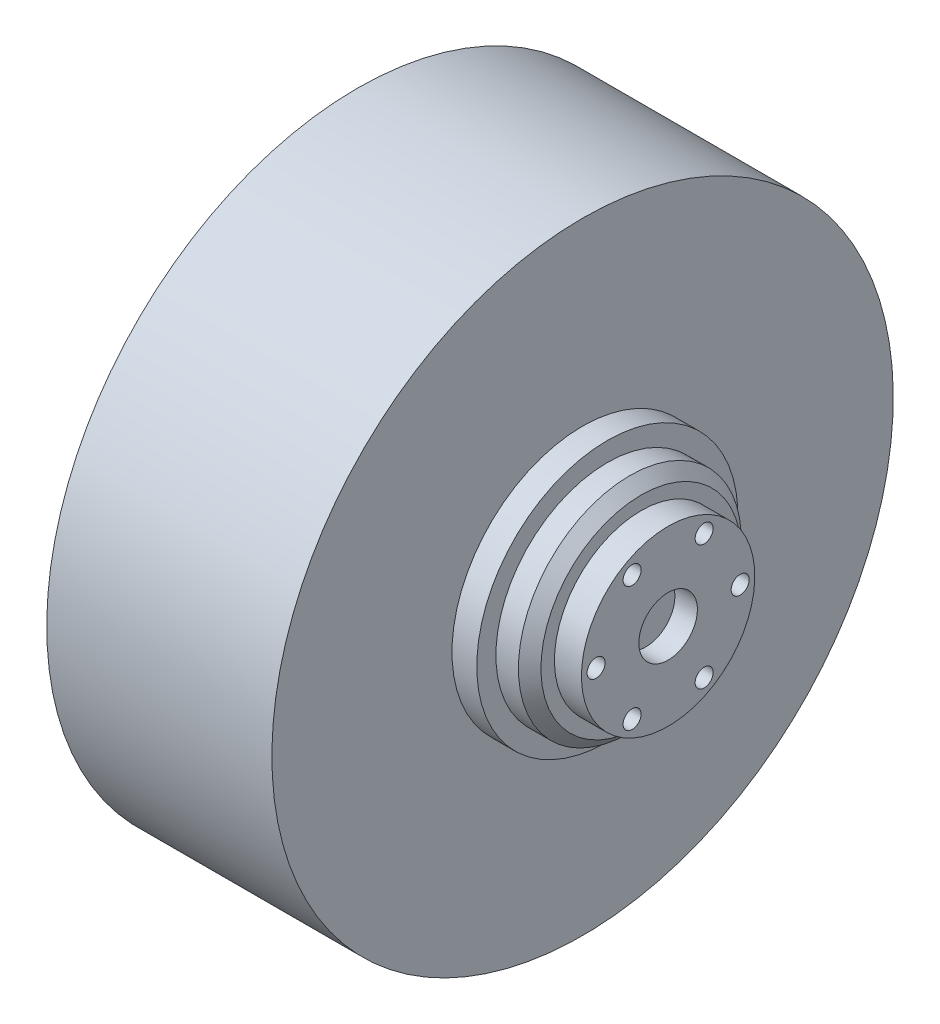
ISO-10303-21;
HEADER;
FILE_DESCRIPTION(('STEP AP214'),'2;1');
FILE_NAME('part.step','',(''),(''),'','','');
FILE_SCHEMA(('AUTOMOTIVE_DESIGN { 1 0 10303 214 1 1 1 1 }'));
ENDSEC;
DATA;
#1=APPLICATION_CONTEXT('core data for automotive mechanical design processes');
#2=APPLICATION_PROTOCOL_DEFINITION('international standard','automotive_design',2000,#1);
#3=PRODUCT_CONTEXT('',#1,'mechanical');
#4=PRODUCT('Part','Part','',(#3));
#5=PRODUCT_RELATED_PRODUCT_CATEGORY('part','',(#4));
#6=PRODUCT_DEFINITION_FORMATION('','',#4);
#7=PRODUCT_DEFINITION_CONTEXT('part definition',#1,'design');
#8=PRODUCT_DEFINITION('design','',#6,#7);
#9=PRODUCT_DEFINITION_SHAPE('','',#8);
#10=(LENGTH_UNIT() NAMED_UNIT(*) SI_UNIT(.MILLI.,.METRE.));
#11=(NAMED_UNIT(*) PLANE_ANGLE_UNIT() SI_UNIT($,.RADIAN.));
#12=(NAMED_UNIT(*) SI_UNIT($,.STERADIAN.) SOLID_ANGLE_UNIT());
#13=UNCERTAINTY_MEASURE_WITH_UNIT(LENGTH_MEASURE(1.E-05),#10,'distance_accuracy_value','');
#14=(GEOMETRIC_REPRESENTATION_CONTEXT(3) GLOBAL_UNCERTAINTY_ASSIGNED_CONTEXT((#13)) GLOBAL_UNIT_ASSIGNED_CONTEXT((#10,
#11,#12)) REPRESENTATION_CONTEXT('',''));
#15=CARTESIAN_POINT('',(0.,0.,0.));
#16=DIRECTION('',(0.,0.,1.));
#17=DIRECTION('',(1.,0.,0.));
#18=AXIS2_PLACEMENT_3D('',#15,#16,#17);
#19=CARTESIAN_POINT('',(-90.,0.,0.));
#20=DIRECTION('',(1.,0.,0.));
#21=DIRECTION('',(0.,1.,0.));
#22=AXIS2_PLACEMENT_3D('',#19,#20,#21);
#23=PLANE('',#22);
#24=CARTESIAN_POINT('',(-90.,0.,0.));
#25=DIRECTION('',(1.,0.,0.));
#26=DIRECTION('',(0.,1.,0.));
#27=AXIS2_PLACEMENT_3D('',#24,#25,#26);
#28=CIRCLE('',#27,36.5);
#29=CARTESIAN_POINT('',(-90.,36.5,0.));
#30=VERTEX_POINT('',#29);
#31=EDGE_CURVE('E10',#30,#30,#28,.T.);
#32=ORIENTED_EDGE('',*,*,#31,.F.);
#33=EDGE_LOOP('',(#32));
#34=FACE_BOUND('',#33,.T.);
#35=ADVANCED_FACE('F34',(#34),#23,.F.);
#36=CARTESIAN_POINT('',(90.,0.,0.));
#37=DIRECTION('',(1.,0.,0.));
#38=DIRECTION('',(0.,1.,0.));
#39=AXIS2_PLACEMENT_3D('',#36,#37,#38);
#40=CYLINDRICAL_SURFACE('',#39,36.5);
#41=CARTESIAN_POINT('',(-70.,0.,0.));
#42=DIRECTION('',(1.,0.,0.));
#43=DIRECTION('',(0.,1.,0.));
#44=AXIS2_PLACEMENT_3D('',#41,#42,#43);
#45=CIRCLE('',#44,36.5);
#46=CARTESIAN_POINT('',(-70.,36.5,0.));
#47=VERTEX_POINT('',#46);
#48=EDGE_CURVE('E40',#47,#47,#45,.T.);
#49=ORIENTED_EDGE('',*,*,#48,.F.);
#50=EDGE_LOOP('',(#49));
#51=FACE_BOUND('',#50,.T.);
#52=ORIENTED_EDGE('',*,*,#31,.T.);
#53=EDGE_LOOP('',(#52));
#54=FACE_BOUND('',#53,.T.);
#55=ADVANCED_FACE('F213',(#51,#54),#40,.T.);
#56=CARTESIAN_POINT('',(-70.,-36.5,0.));
#57=DIRECTION('',(1.,0.,0.));
#58=DIRECTION('',(0.,1.,0.));
#59=AXIS2_PLACEMENT_3D('',#56,#57,#58);
#60=PLANE('',#59);
#61=CARTESIAN_POINT('',(-70.,0.,0.));
#62=DIRECTION('',(1.,0.,0.));
#63=DIRECTION('',(0.,1.,0.));
#64=AXIS2_PLACEMENT_3D('',#61,#62,#63);
#65=CIRCLE('',#64,47.);
#66=CARTESIAN_POINT('',(-70.,47.,0.));
#67=VERTEX_POINT('',#66);
#68=EDGE_CURVE('E44',#67,#67,#65,.T.);
#69=ORIENTED_EDGE('',*,*,#68,.F.);
#70=EDGE_LOOP('',(#69));
#71=FACE_BOUND('',#70,.T.);
#72=ORIENTED_EDGE('',*,*,#48,.T.);
#73=EDGE_LOOP('',(#72));
#74=FACE_BOUND('',#73,.T.);
#75=ADVANCED_FACE('F208',(#71,#74),#60,.F.);
#76=CARTESIAN_POINT('',(90.,0.,0.));
#77=DIRECTION('',(1.,0.,0.));
#78=DIRECTION('',(0.,1.,0.));
#79=AXIS2_PLACEMENT_3D('',#76,#77,#78);
#80=CYLINDRICAL_SURFACE('',#79,47.);
#81=CARTESIAN_POINT('',(-48.,0.,0.));
#82=DIRECTION('',(1.,0.,0.));
#83=DIRECTION('',(0.,1.,0.));
#84=AXIS2_PLACEMENT_3D('',#81,#82,#83);
#85=CIRCLE('',#84,47.);
#86=CARTESIAN_POINT('',(-48.,47.,0.));
#87=VERTEX_POINT('',#86);
#88=EDGE_CURVE('E48',#87,#87,#85,.T.);
#89=ORIENTED_EDGE('',*,*,#88,.F.);
#90=EDGE_LOOP('',(#89));
#91=FACE_BOUND('',#90,.T.);
#92=ORIENTED_EDGE('',*,*,#68,.T.);
#93=EDGE_LOOP('',(#92));
#94=FACE_BOUND('',#93,.T.);
#95=ADVANCED_FACE('F202',(#91,#94),#80,.T.);
#96=CARTESIAN_POINT('',(-48.,-47.,0.));
#97=DIRECTION('',(1.,0.,0.));
#98=DIRECTION('',(0.,1.,0.));
#99=AXIS2_PLACEMENT_3D('',#96,#97,#98);
#100=PLANE('',#99);
#101=CARTESIAN_POINT('',(-48.,0.,0.));
#102=DIRECTION('',(1.,0.,0.));
#103=DIRECTION('',(0.,1.,0.));
#104=AXIS2_PLACEMENT_3D('',#101,#102,#103);
#105=CIRCLE('',#104,138.);
#106=CARTESIAN_POINT('',(-48.,138.,0.));
#107=VERTEX_POINT('',#106);
#108=EDGE_CURVE('E53',#107,#107,#105,.T.);
#109=ORIENTED_EDGE('',*,*,#108,.F.);
#110=EDGE_LOOP('',(#109));
#111=FACE_BOUND('',#110,.T.);
#112=ORIENTED_EDGE('',*,*,#88,.T.);
#113=EDGE_LOOP('',(#112));
#114=FACE_BOUND('',#113,.T.);
#115=ADVANCED_FACE('F196',(#111,#114),#100,.F.);
#116=CARTESIAN_POINT('',(90.,0.,0.));
#117=DIRECTION('',(1.,0.,0.));
#118=DIRECTION('',(0.,1.,0.));
#119=AXIS2_PLACEMENT_3D('',#116,#117,#118);
#120=CYLINDRICAL_SURFACE('',#119,138.);
#121=CARTESIAN_POINT('',(52.,0.,0.));
#122=DIRECTION('',(1.,0.,0.));
#123=DIRECTION('',(0.,1.,0.));
#124=AXIS2_PLACEMENT_3D('',#121,#122,#123);
#125=CIRCLE('',#124,138.);
#126=CARTESIAN_POINT('',(52.,138.,0.));
#127=VERTEX_POINT('',#126);
#128=EDGE_CURVE('E56',#127,#127,#125,.T.);
#129=ORIENTED_EDGE('',*,*,#128,.F.);
#130=EDGE_LOOP('',(#129));
#131=FACE_BOUND('',#130,.T.);
#132=ORIENTED_EDGE('',*,*,#108,.T.);
#133=EDGE_LOOP('',(#132));
#134=FACE_BOUND('',#133,.T.);
#135=ADVANCED_FACE('F190',(#131,#134),#120,.T.);
#136=CARTESIAN_POINT('',(52.,-138.,0.));
#137=DIRECTION('',(-1.,0.,0.));
#138=DIRECTION('',(0.,-1.,0.));
#139=AXIS2_PLACEMENT_3D('',#136,#137,#138);
#140=PLANE('',#139);
#141=CARTESIAN_POINT('',(52.,0.,0.));
#142=DIRECTION('',(1.,0.,0.));
#143=DIRECTION('',(0.,1.,0.));
#144=AXIS2_PLACEMENT_3D('',#141,#142,#143);
#145=CIRCLE('',#144,58.);
#146=CARTESIAN_POINT('',(52.,58.,0.));
#147=VERTEX_POINT('',#146);
#148=EDGE_CURVE('E59',#147,#147,#145,.T.);
#149=ORIENTED_EDGE('',*,*,#148,.F.);
#150=EDGE_LOOP('',(#149));
#151=FACE_BOUND('',#150,.T.);
#152=ORIENTED_EDGE('',*,*,#128,.T.);
#153=EDGE_LOOP('',(#152));
#154=FACE_BOUND('',#153,.T.);
#155=ADVANCED_FACE('F184',(#151,#154),#140,.F.);
#156=CARTESIAN_POINT('',(90.,0.,0.));
#157=DIRECTION('',(1.,0.,0.));
#158=DIRECTION('',(0.,1.,0.));
#159=AXIS2_PLACEMENT_3D('',#156,#157,#158);
#160=CYLINDRICAL_SURFACE('',#159,58.);
#161=CARTESIAN_POINT('',(63.,0.,0.));
#162=DIRECTION('',(1.,0.,0.));
#163=DIRECTION('',(0.,1.,0.));
#164=AXIS2_PLACEMENT_3D('',#161,#162,#163);
#165=CIRCLE('',#164,58.);
#166=CARTESIAN_POINT('',(63.,58.,0.));
#167=VERTEX_POINT('',#166);
#168=EDGE_CURVE('E62',#167,#167,#165,.T.);
#169=ORIENTED_EDGE('',*,*,#168,.F.);
#170=EDGE_LOOP('',(#169));
#171=FACE_BOUND('',#170,.T.);
#172=ORIENTED_EDGE('',*,*,#148,.T.);
#173=EDGE_LOOP('',(#172));
#174=FACE_BOUND('',#173,.T.);
#175=ADVANCED_FACE('F178',(#171,#174),#160,.T.);
#176=CARTESIAN_POINT('',(63.,-58.,0.));
#177=DIRECTION('',(-1.,0.,0.));
#178=DIRECTION('',(0.,-1.,0.));
#179=AXIS2_PLACEMENT_3D('',#176,#177,#178);
#180=PLANE('',#179);
#181=CARTESIAN_POINT('',(63.,0.,0.));
#182=DIRECTION('',(1.,0.,0.));
#183=DIRECTION('',(0.,1.,0.));
#184=AXIS2_PLACEMENT_3D('',#181,#182,#183);
#185=CIRCLE('',#184,49.5);
#186=CARTESIAN_POINT('',(63.,49.5,0.));
#187=VERTEX_POINT('',#186);
#188=EDGE_CURVE('E65',#187,#187,#185,.T.);
#189=ORIENTED_EDGE('',*,*,#188,.F.);
#190=EDGE_LOOP('',(#189));
#191=FACE_BOUND('',#190,.T.);
#192=ORIENTED_EDGE('',*,*,#168,.T.);
#193=EDGE_LOOP('',(#192));
#194=FACE_BOUND('',#193,.T.);
#195=ADVANCED_FACE('F172',(#191,#194),#180,.F.);
#196=CARTESIAN_POINT('',(90.,0.,0.));
#197=DIRECTION('',(1.,0.,0.));
#198=DIRECTION('',(0.,1.,0.));
#199=AXIS2_PLACEMENT_3D('',#196,#197,#198);
#200=CYLINDRICAL_SURFACE('',#199,49.5);
#201=CARTESIAN_POINT('',(73.,0.,0.));
#202=DIRECTION('',(1.,0.,0.));
#203=DIRECTION('',(0.,1.,0.));
#204=AXIS2_PLACEMENT_3D('',#201,#202,#203);
#205=CIRCLE('',#204,49.5);
#206=CARTESIAN_POINT('',(73.,49.5,0.));
#207=VERTEX_POINT('',#206);
#208=EDGE_CURVE('E68',#207,#207,#205,.T.);
#209=ORIENTED_EDGE('',*,*,#208,.F.);
#210=EDGE_LOOP('',(#209));
#211=FACE_BOUND('',#210,.T.);
#212=ORIENTED_EDGE('',*,*,#188,.T.);
#213=EDGE_LOOP('',(#212));
#214=FACE_BOUND('',#213,.T.);
#215=ADVANCED_FACE('F166',(#211,#214),#200,.T.);
#216=CARTESIAN_POINT('',(73.,0.,0.));
#217=DIRECTION('',(-1.,0.,0.));
#218=DIRECTION('',(0.,-1.,0.));
#219=AXIS2_PLACEMENT_3D('',#216,#217,#218);
#220=CONICAL_SURFACE('',#219,49.5,0.785398163397448);
#221=CARTESIAN_POINT('',(78.,0.,0.));
#222=DIRECTION('',(1.,0.,0.));
#223=DIRECTION('',(0.,1.,0.));
#224=AXIS2_PLACEMENT_3D('',#221,#222,#223);
#225=CIRCLE('',#224,44.5);
#226=CARTESIAN_POINT('',(78.,44.5,0.));
#227=VERTEX_POINT('',#226);
#228=EDGE_CURVE('E71',#227,#227,#225,.T.);
#229=ORIENTED_EDGE('',*,*,#228,.F.);
#230=EDGE_LOOP('',(#229));
#231=FACE_BOUND('',#230,.T.);
#232=ORIENTED_EDGE('',*,*,#208,.T.);
#233=EDGE_LOOP('',(#232));
#234=FACE_BOUND('',#233,.T.);
#235=ADVANCED_FACE('F160',(#231,#234),#220,.T.);
#236=CARTESIAN_POINT('',(78.,-44.5,0.));
#237=DIRECTION('',(-1.,0.,0.));
#238=DIRECTION('',(0.,-1.,0.));
#239=AXIS2_PLACEMENT_3D('',#236,#237,#238);
#240=PLANE('',#239);
#241=CARTESIAN_POINT('',(78.,0.,0.));
#242=DIRECTION('',(1.,0.,0.));
#243=DIRECTION('',(0.,1.,0.));
#244=AXIS2_PLACEMENT_3D('',#241,#242,#243);
#245=CIRCLE('',#244,38.5);
#246=CARTESIAN_POINT('',(78.,38.5,0.));
#247=VERTEX_POINT('',#246);
#248=EDGE_CURVE('E74',#247,#247,#245,.T.);
#249=ORIENTED_EDGE('',*,*,#248,.F.);
#250=EDGE_LOOP('',(#249));
#251=FACE_BOUND('',#250,.T.);
#252=ORIENTED_EDGE('',*,*,#228,.T.);
#253=EDGE_LOOP('',(#252));
#254=FACE_BOUND('',#253,.T.);
#255=ADVANCED_FACE('F154',(#251,#254),#240,.F.);
#256=CARTESIAN_POINT('',(90.,0.,0.));
#257=DIRECTION('',(1.,0.,0.));
#258=DIRECTION('',(0.,1.,0.));
#259=AXIS2_PLACEMENT_3D('',#256,#257,#258);
#260=CYLINDRICAL_SURFACE('',#259,38.5);
#261=CARTESIAN_POINT('',(90.,0.,0.));
#262=DIRECTION('',(1.,0.,0.));
#263=DIRECTION('',(0.,1.,0.));
#264=AXIS2_PLACEMENT_3D('',#261,#262,#263);
#265=CIRCLE('',#264,38.5);
#266=CARTESIAN_POINT('',(90.,38.5,0.));
#267=VERTEX_POINT('',#266);
#268=EDGE_CURVE('E77',#267,#267,#265,.T.);
#269=ORIENTED_EDGE('',*,*,#268,.F.);
#270=EDGE_LOOP('',(#269));
#271=FACE_BOUND('',#270,.T.);
#272=ORIENTED_EDGE('',*,*,#248,.T.);
#273=EDGE_LOOP('',(#272));
#274=FACE_BOUND('',#273,.T.);
#275=ADVANCED_FACE('F136',(#271,#274),#260,.T.);
#276=CARTESIAN_POINT('',(90.,-38.5,0.));
#277=DIRECTION('',(-1.,0.,0.));
#278=DIRECTION('',(0.,-1.,0.));
#279=AXIS2_PLACEMENT_3D('',#276,#277,#278);
#280=PLANE('',#279);
#281=CARTESIAN_POINT('',(90.,0.,0.));
#282=DIRECTION('',(1.,0.,0.));
#283=DIRECTION('',(0.,1.,0.));
#284=AXIS2_PLACEMENT_3D('',#281,#282,#283);
#285=CIRCLE('',#284,13.);
#286=CARTESIAN_POINT('',(90.,13.,0.));
#287=VERTEX_POINT('',#286);
#288=EDGE_CURVE('E117',#287,#287,#285,.T.);
#289=ORIENTED_EDGE('',*,*,#288,.F.);
#290=EDGE_LOOP('',(#289));
#291=FACE_BOUND('',#290,.T.);
#292=CARTESIAN_POINT('',(90.,27.712812921102,16.));
#293=DIRECTION('',(1.,0.,0.));
#294=DIRECTION('',(0.,1.,0.));
#295=AXIS2_PLACEMENT_3D('',#292,#293,#294);
#296=CIRCLE('',#295,4.);
#297=CARTESIAN_POINT('',(90.,31.712812921102,16.));
#298=VERTEX_POINT('',#297);
#299=EDGE_CURVE('E87',#298,#298,#296,.T.);
#300=ORIENTED_EDGE('',*,*,#299,.F.);
#301=EDGE_LOOP('',(#300));
#302=FACE_BOUND('',#301,.T.);
#303=CARTESIAN_POINT('',(90.,0.,32.));
#304=DIRECTION('',(1.,0.,0.));
#305=DIRECTION('',(0.,1.,0.));
#306=AXIS2_PLACEMENT_3D('',#303,#304,#305);
#307=CIRCLE('',#306,4.);
#308=CARTESIAN_POINT('',(90.,4.00000000000002,32.));
#309=VERTEX_POINT('',#308);
#310=EDGE_CURVE('E94',#309,#309,#307,.T.);
#311=ORIENTED_EDGE('',*,*,#310,.F.);
#312=EDGE_LOOP('',(#311));
#313=FACE_BOUND('',#312,.T.);
#314=CARTESIAN_POINT('',(90.,-27.712812921102,16.));
#315=DIRECTION('',(1.,0.,0.));
#316=DIRECTION('',(0.,1.,0.));
#317=AXIS2_PLACEMENT_3D('',#314,#315,#316);
#318=CIRCLE('',#317,4.);
#319=CARTESIAN_POINT('',(90.,-23.712812921102,16.));
#320=VERTEX_POINT('',#319);
#321=EDGE_CURVE('E100',#320,#320,#318,.T.);
#322=ORIENTED_EDGE('',*,*,#321,.F.);
#323=EDGE_LOOP('',(#322));
#324=FACE_BOUND('',#323,.T.);
#325=CARTESIAN_POINT('',(90.,-27.712812921102,-16.));
#326=DIRECTION('',(1.,0.,0.));
#327=DIRECTION('',(0.,1.,0.));
#328=AXIS2_PLACEMENT_3D('',#325,#326,#327);
#329=CIRCLE('',#328,4.);
#330=CARTESIAN_POINT('',(90.,-23.712812921102,-16.));
#331=VERTEX_POINT('',#330);
#332=EDGE_CURVE('E106',#331,#331,#329,.T.);
#333=ORIENTED_EDGE('',*,*,#332,.F.);
#334=EDGE_LOOP('',(#333));
#335=FACE_BOUND('',#334,.T.);
#336=CARTESIAN_POINT('',(90.,0.,-32.));
#337=DIRECTION('',(1.,0.,0.));
#338=DIRECTION('',(0.,1.,0.));
#339=AXIS2_PLACEMENT_3D('',#336,#337,#338);
#340=CIRCLE('',#339,4.);
#341=CARTESIAN_POINT('',(90.,4.00000000000001,-32.));
#342=VERTEX_POINT('',#341);
#343=EDGE_CURVE('E112',#342,#342,#340,.T.);
#344=ORIENTED_EDGE('',*,*,#343,.F.);
#345=EDGE_LOOP('',(#344));
#346=FACE_BOUND('',#345,.T.);
#347=CARTESIAN_POINT('',(90.,27.712812921102,-16.));
#348=DIRECTION('',(1.,0.,0.));
#349=DIRECTION('',(0.,1.,0.));
#350=AXIS2_PLACEMENT_3D('',#347,#348,#349);
#351=CIRCLE('',#350,4.);
#352=CARTESIAN_POINT('',(90.,31.712812921102,-16.));
#353=VERTEX_POINT('',#352);
#354=EDGE_CURVE('E81',#353,#353,#351,.T.);
#355=ORIENTED_EDGE('',*,*,#354,.F.);
#356=EDGE_LOOP('',(#355));
#357=FACE_BOUND('',#356,.T.);
#358=ORIENTED_EDGE('',*,*,#268,.T.);
#359=EDGE_LOOP('',(#358));
#360=FACE_BOUND('',#359,.T.);
#361=ADVANCED_FACE('F132',(#291,#302,#313,#324,#335,#346,#357,#360),#280,.F.);
#362=CARTESIAN_POINT('',(80.,27.712812921102,-16.));
#363=DIRECTION('',(1.,0.,0.));
#364=DIRECTION('',(0.,1.,0.));
#365=AXIS2_PLACEMENT_3D('',#362,#363,#364);
#366=CYLINDRICAL_SURFACE('',#365,4.);
#367=CARTESIAN_POINT('',(80.,27.712812921102,-16.));
#368=DIRECTION('',(1.,0.,0.));
#369=DIRECTION('',(0.,1.,0.));
#370=AXIS2_PLACEMENT_3D('',#367,#368,#369);
#371=CIRCLE('',#370,4.);
#372=CARTESIAN_POINT('',(80.,31.712812921102,-16.));
#373=VERTEX_POINT('',#372);
#374=EDGE_CURVE('E80',#373,#373,#371,.T.);
#375=ORIENTED_EDGE('',*,*,#374,.F.);
#376=EDGE_LOOP('',(#375));
#377=FACE_BOUND('',#376,.T.);
#378=ORIENTED_EDGE('',*,*,#354,.T.);
#379=EDGE_LOOP('',(#378));
#380=FACE_BOUND('',#379,.T.);
#381=ADVANCED_FACE('F135',(#377,#380),#366,.F.);
#382=CARTESIAN_POINT('',(80.,27.712812921102,-16.));
#383=DIRECTION('',(1.,0.,0.));
#384=DIRECTION('',(0.,1.,0.));
#385=AXIS2_PLACEMENT_3D('',#382,#383,#384);
#386=PLANE('',#385);
#387=ORIENTED_EDGE('',*,*,#374,.T.);
#388=EDGE_LOOP('',(#387));
#389=FACE_BOUND('',#388,.T.);
#390=ADVANCED_FACE('F301',(#389),#386,.T.);
#391=CARTESIAN_POINT('',(80.,0.,-32.));
#392=DIRECTION('',(1.,0.,0.));
#393=DIRECTION('',(0.,1.,0.));
#394=AXIS2_PLACEMENT_3D('',#391,#392,#393);
#395=CYLINDRICAL_SURFACE('',#394,4.);
#396=CARTESIAN_POINT('',(80.,0.,-32.));
#397=DIRECTION('',(1.,0.,0.));
#398=DIRECTION('',(0.,1.,0.));
#399=AXIS2_PLACEMENT_3D('',#396,#397,#398);
#400=CIRCLE('',#399,4.);
#401=CARTESIAN_POINT('',(80.,4.00000000000001,-32.));
#402=VERTEX_POINT('',#401);
#403=EDGE_CURVE('E84',#402,#402,#400,.T.);
#404=ORIENTED_EDGE('',*,*,#403,.F.);
#405=EDGE_LOOP('',(#404));
#406=FACE_BOUND('',#405,.T.);
#407=ORIENTED_EDGE('',*,*,#343,.T.);
#408=EDGE_LOOP('',(#407));
#409=FACE_BOUND('',#408,.T.);
#410=ADVANCED_FACE('F311',(#406,#409),#395,.F.);
#411=CARTESIAN_POINT('',(80.,0.,-32.));
#412=DIRECTION('',(1.,0.,0.));
#413=DIRECTION('',(0.,1.,0.));
#414=AXIS2_PLACEMENT_3D('',#411,#412,#413);
#415=PLANE('',#414);
#416=ORIENTED_EDGE('',*,*,#403,.T.);
#417=EDGE_LOOP('',(#416));
#418=FACE_BOUND('',#417,.T.);
#419=ADVANCED_FACE('F321',(#418),#415,.T.);
#420=CARTESIAN_POINT('',(80.,-27.712812921102,-16.));
#421=DIRECTION('',(1.,0.,0.));
#422=DIRECTION('',(0.,1.,0.));
#423=AXIS2_PLACEMENT_3D('',#420,#421,#422);
#424=CYLINDRICAL_SURFACE('',#423,4.);
#425=CARTESIAN_POINT('',(80.,-27.712812921102,-16.));
#426=DIRECTION('',(1.,0.,0.));
#427=DIRECTION('',(0.,1.,0.));
#428=AXIS2_PLACEMENT_3D('',#425,#426,#427);
#429=CIRCLE('',#428,4.);
#430=CARTESIAN_POINT('',(80.,-23.712812921102,-16.));
#431=VERTEX_POINT('',#430);
#432=EDGE_CURVE('E109',#431,#431,#429,.T.);
#433=ORIENTED_EDGE('',*,*,#432,.F.);
#434=EDGE_LOOP('',(#433));
#435=FACE_BOUND('',#434,.T.);
#436=ORIENTED_EDGE('',*,*,#332,.T.);
#437=EDGE_LOOP('',(#436));
#438=FACE_BOUND('',#437,.T.);
#439=ADVANCED_FACE('F331',(#435,#438),#424,.F.);
#440=CARTESIAN_POINT('',(80.,-27.712812921102,-16.));
#441=DIRECTION('',(1.,0.,0.));
#442=DIRECTION('',(0.,1.,0.));
#443=AXIS2_PLACEMENT_3D('',#440,#441,#442);
#444=PLANE('',#443);
#445=ORIENTED_EDGE('',*,*,#432,.T.);
#446=EDGE_LOOP('',(#445));
#447=FACE_BOUND('',#446,.T.);
#448=ADVANCED_FACE('F341',(#447),#444,.T.);
#449=CARTESIAN_POINT('',(80.,-27.712812921102,16.));
#450=DIRECTION('',(1.,0.,0.));
#451=DIRECTION('',(0.,1.,0.));
#452=AXIS2_PLACEMENT_3D('',#449,#450,#451);
#453=CYLINDRICAL_SURFACE('',#452,4.);
#454=CARTESIAN_POINT('',(80.,-27.712812921102,16.));
#455=DIRECTION('',(1.,0.,0.));
#456=DIRECTION('',(0.,1.,0.));
#457=AXIS2_PLACEMENT_3D('',#454,#455,#456);
#458=CIRCLE('',#457,4.);
#459=CARTESIAN_POINT('',(80.,-23.712812921102,16.));
#460=VERTEX_POINT('',#459);
#461=EDGE_CURVE('E103',#460,#460,#458,.T.);
#462=ORIENTED_EDGE('',*,*,#461,.F.);
#463=EDGE_LOOP('',(#462));
#464=FACE_BOUND('',#463,.T.);
#465=ORIENTED_EDGE('',*,*,#321,.T.);
#466=EDGE_LOOP('',(#465));
#467=FACE_BOUND('',#466,.T.);
#468=ADVANCED_FACE('F351',(#464,#467),#453,.F.);
#469=CARTESIAN_POINT('',(80.,-27.712812921102,16.));
#470=DIRECTION('',(1.,0.,0.));
#471=DIRECTION('',(0.,1.,0.));
#472=AXIS2_PLACEMENT_3D('',#469,#470,#471);
#473=PLANE('',#472);
#474=ORIENTED_EDGE('',*,*,#461,.T.);
#475=EDGE_LOOP('',(#474));
#476=FACE_BOUND('',#475,.T.);
#477=ADVANCED_FACE('F361',(#476),#473,.T.);
#478=CARTESIAN_POINT('',(80.,0.,32.));
#479=DIRECTION('',(1.,0.,0.));
#480=DIRECTION('',(0.,1.,0.));
#481=AXIS2_PLACEMENT_3D('',#478,#479,#480);
#482=CYLINDRICAL_SURFACE('',#481,4.);
#483=CARTESIAN_POINT('',(80.,0.,32.));
#484=DIRECTION('',(1.,0.,0.));
#485=DIRECTION('',(0.,1.,0.));
#486=AXIS2_PLACEMENT_3D('',#483,#484,#485);
#487=CIRCLE('',#486,4.);
#488=CARTESIAN_POINT('',(80.,4.00000000000001,32.));
#489=VERTEX_POINT('',#488);
#490=EDGE_CURVE('E97',#489,#489,#487,.T.);
#491=ORIENTED_EDGE('',*,*,#490,.F.);
#492=EDGE_LOOP('',(#491));
#493=FACE_BOUND('',#492,.T.);
#494=ORIENTED_EDGE('',*,*,#310,.T.);
#495=EDGE_LOOP('',(#494));
#496=FACE_BOUND('',#495,.T.);
#497=ADVANCED_FACE('F371',(#493,#496),#482,.F.);
#498=CARTESIAN_POINT('',(80.,0.,32.));
#499=DIRECTION('',(1.,0.,0.));
#500=DIRECTION('',(0.,1.,0.));
#501=AXIS2_PLACEMENT_3D('',#498,#499,#500);
#502=PLANE('',#501);
#503=ORIENTED_EDGE('',*,*,#490,.T.);
#504=EDGE_LOOP('',(#503));
#505=FACE_BOUND('',#504,.T.);
#506=ADVANCED_FACE('F381',(#505),#502,.T.);
#507=CARTESIAN_POINT('',(80.,27.712812921102,16.));
#508=DIRECTION('',(1.,0.,0.));
#509=DIRECTION('',(0.,1.,0.));
#510=AXIS2_PLACEMENT_3D('',#507,#508,#509);
#511=CYLINDRICAL_SURFACE('',#510,4.);
#512=CARTESIAN_POINT('',(80.,27.712812921102,16.));
#513=DIRECTION('',(1.,0.,0.));
#514=DIRECTION('',(0.,1.,0.));
#515=AXIS2_PLACEMENT_3D('',#512,#513,#514);
#516=CIRCLE('',#515,4.);
#517=CARTESIAN_POINT('',(80.,31.712812921102,16.));
#518=VERTEX_POINT('',#517);
#519=EDGE_CURVE('E90',#518,#518,#516,.T.);
#520=ORIENTED_EDGE('',*,*,#519,.F.);
#521=EDGE_LOOP('',(#520));
#522=FACE_BOUND('',#521,.T.);
#523=ORIENTED_EDGE('',*,*,#299,.T.);
#524=EDGE_LOOP('',(#523));
#525=FACE_BOUND('',#524,.T.);
#526=ADVANCED_FACE('F391',(#522,#525),#511,.F.);
#527=CARTESIAN_POINT('',(80.,27.712812921102,16.));
#528=DIRECTION('',(1.,0.,0.));
#529=DIRECTION('',(0.,1.,0.));
#530=AXIS2_PLACEMENT_3D('',#527,#528,#529);
#531=PLANE('',#530);
#532=ORIENTED_EDGE('',*,*,#519,.T.);
#533=EDGE_LOOP('',(#532));
#534=FACE_BOUND('',#533,.T.);
#535=ADVANCED_FACE('F128',(#534),#531,.T.);
#536=CARTESIAN_POINT('',(80.,0.,0.));
#537=DIRECTION('',(1.,0.,0.));
#538=DIRECTION('',(0.,1.,0.));
#539=AXIS2_PLACEMENT_3D('',#536,#537,#538);
#540=CYLINDRICAL_SURFACE('',#539,13.);
#541=CARTESIAN_POINT('',(80.,0.,0.));
#542=DIRECTION('',(1.,0.,0.));
#543=DIRECTION('',(0.,1.,0.));
#544=AXIS2_PLACEMENT_3D('',#541,#542,#543);
#545=CIRCLE('',#544,13.);
#546=CARTESIAN_POINT('',(80.,13.,0.));
#547=VERTEX_POINT('',#546);
#548=EDGE_CURVE('E91',#547,#547,#545,.T.);
#549=ORIENTED_EDGE('',*,*,#548,.F.);
#550=EDGE_LOOP('',(#549));
#551=FACE_BOUND('',#550,.T.);
#552=ORIENTED_EDGE('',*,*,#288,.T.);
#553=EDGE_LOOP('',(#552));
#554=FACE_BOUND('',#553,.T.);
#555=ADVANCED_FACE('F125',(#551,#554),#540,.F.);
#556=CARTESIAN_POINT('',(80.,0.,0.));
#557=DIRECTION('',(1.,0.,0.));
#558=DIRECTION('',(0.,1.,0.));
#559=AXIS2_PLACEMENT_3D('',#556,#557,#558);
#560=PLANE('',#559);
#561=ORIENTED_EDGE('',*,*,#548,.T.);
#562=EDGE_LOOP('',(#561));
#563=FACE_BOUND('',#562,.T.);
#564=ADVANCED_FACE('F123',(#563),#560,.T.);
#565=CLOSED_SHELL('',(#35,#55,#75,#95,#115,#135,#155,#175,#195,#215,#235,#255,#275,#361,#381,
#390,#410,#419,#439,#448,#468,#477,#497,#506,#526,#535,#555,#564));
#566=MANIFOLD_SOLID_BREP('B2',#565);
#567=ADVANCED_BREP_SHAPE_REPRESENTATION('',(#18,#566),#14);
#568=SHAPE_DEFINITION_REPRESENTATION(#9,#567);
ENDSEC;
END-ISO-10303-21;
